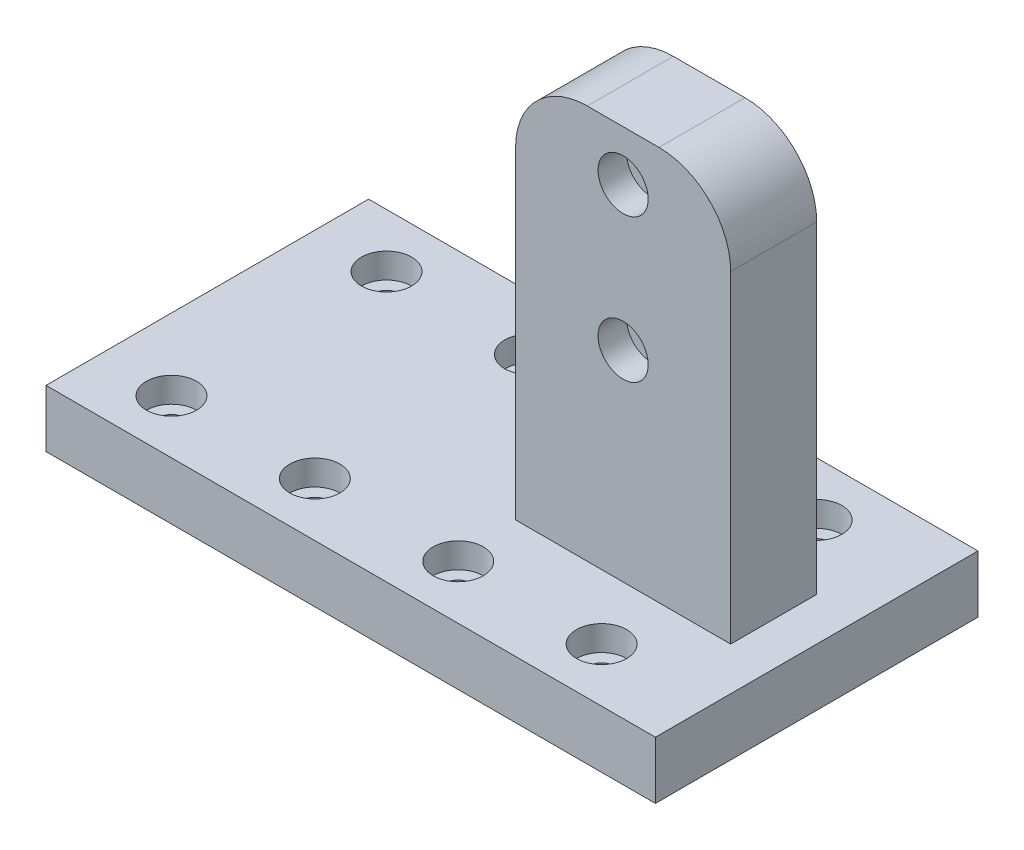
ISO-10303-21;
HEADER;
FILE_DESCRIPTION(('STEP AP214'),'2;1');
FILE_NAME('part.step','',(''),(''),'','','');
FILE_SCHEMA(('AUTOMOTIVE_DESIGN { 1 0 10303 214 1 1 1 1 }'));
ENDSEC;
DATA;
#1=APPLICATION_CONTEXT('core data for automotive mechanical design processes');
#2=APPLICATION_PROTOCOL_DEFINITION('international standard','automotive_design',2000,#1);
#3=PRODUCT_CONTEXT('',#1,'mechanical');
#4=PRODUCT('Part','Part','',(#3));
#5=PRODUCT_RELATED_PRODUCT_CATEGORY('part','',(#4));
#6=PRODUCT_DEFINITION_FORMATION('','',#4);
#7=PRODUCT_DEFINITION_CONTEXT('part definition',#1,'design');
#8=PRODUCT_DEFINITION('design','',#6,#7);
#9=PRODUCT_DEFINITION_SHAPE('','',#8);
#10=(LENGTH_UNIT() NAMED_UNIT(*) SI_UNIT(.MILLI.,.METRE.));
#11=(NAMED_UNIT(*) PLANE_ANGLE_UNIT() SI_UNIT($,.RADIAN.));
#12=(NAMED_UNIT(*) SI_UNIT($,.STERADIAN.) SOLID_ANGLE_UNIT());
#13=UNCERTAINTY_MEASURE_WITH_UNIT(LENGTH_MEASURE(1.E-05),#10,'distance_accuracy_value','');
#14=(GEOMETRIC_REPRESENTATION_CONTEXT(3) GLOBAL_UNCERTAINTY_ASSIGNED_CONTEXT((#13)) GLOBAL_UNIT_ASSIGNED_CONTEXT((#10,
#11,#12)) REPRESENTATION_CONTEXT('',''));
#15=CARTESIAN_POINT('',(0.,0.,0.));
#16=DIRECTION('',(0.,0.,1.));
#17=DIRECTION('',(1.,0.,0.));
#18=AXIS2_PLACEMENT_3D('',#15,#16,#17);
#19=CARTESIAN_POINT('',(14.,36.,6.));
#20=DIRECTION('',(0.,0.,-1.));
#21=DIRECTION('',(-1.,0.,0.));
#22=AXIS2_PLACEMENT_3D('',#19,#20,#21);
#23=CYLINDRICAL_SURFACE('',#22,1.75);
#24=CARTESIAN_POINT('',(14.,36.,-6.));
#25=DIRECTION('',(0.,0.,-1.));
#26=DIRECTION('',(-1.,0.,0.));
#27=AXIS2_PLACEMENT_3D('',#24,#25,#26);
#28=CIRCLE('',#27,1.75);
#29=CARTESIAN_POINT('',(12.25,36.,-6.));
#30=VERTEX_POINT('',#29);
#31=EDGE_CURVE('E230',#30,#30,#28,.T.);
#32=ORIENTED_EDGE('',*,*,#31,.T.);
#33=EDGE_LOOP('',(#32));
#34=FACE_BOUND('',#33,.T.);
#35=CARTESIAN_POINT('',(14.,36.,2.));
#36=DIRECTION('',(0.,0.,1.));
#37=DIRECTION('',(1.,0.,0.));
#38=AXIS2_PLACEMENT_3D('',#35,#36,#37);
#39=CIRCLE('',#38,1.75);
#40=CARTESIAN_POINT('',(15.75,36.,2.));
#41=VERTEX_POINT('',#40);
#42=EDGE_CURVE('E48',#41,#41,#39,.F.);
#43=ORIENTED_EDGE('',*,*,#42,.F.);
#44=EDGE_LOOP('',(#43));
#45=FACE_BOUND('',#44,.T.);
#46=ADVANCED_FACE('F44',(#34,#45),#23,.F.);
#47=CARTESIAN_POINT('',(14.,56.,6.));
#48=DIRECTION('',(0.,0.,-1.));
#49=DIRECTION('',(-1.,0.,0.));
#50=AXIS2_PLACEMENT_3D('',#47,#48,#49);
#51=CYLINDRICAL_SURFACE('',#50,1.75);
#52=CARTESIAN_POINT('',(14.,56.,-6.));
#53=DIRECTION('',(0.,0.,-1.));
#54=DIRECTION('',(-1.,0.,0.));
#55=AXIS2_PLACEMENT_3D('',#52,#53,#54);
#56=CIRCLE('',#55,1.75);
#57=CARTESIAN_POINT('',(12.25,56.,-6.));
#58=VERTEX_POINT('',#57);
#59=EDGE_CURVE('E248',#58,#58,#56,.T.);
#60=ORIENTED_EDGE('',*,*,#59,.T.);
#61=EDGE_LOOP('',(#60));
#62=FACE_BOUND('',#61,.T.);
#63=CARTESIAN_POINT('',(14.,56.,2.));
#64=DIRECTION('',(0.,0.,1.));
#65=DIRECTION('',(1.,0.,0.));
#66=AXIS2_PLACEMENT_3D('',#63,#64,#65);
#67=CIRCLE('',#66,1.75);
#68=CARTESIAN_POINT('',(15.75,56.,2.));
#69=VERTEX_POINT('',#68);
#70=EDGE_CURVE('E221',#69,#69,#67,.F.);
#71=ORIENTED_EDGE('',*,*,#70,.F.);
#72=EDGE_LOOP('',(#71));
#73=FACE_BOUND('',#72,.T.);
#74=ADVANCED_FACE('F413',(#62,#73),#51,.F.);
#75=CARTESIAN_POINT('',(0.,8.,0.));
#76=DIRECTION('',(0.,1.,0.));
#77=DIRECTION('',(0.,0.,1.));
#78=AXIS2_PLACEMENT_3D('',#75,#76,#77);
#79=PLANE('',#78);
#80=DIRECTION('',(0.,0.,1.));
#81=VECTOR('',#80,1.);
#82=CARTESIAN_POINT('',(35.,8.,22.5));
#83=LINE('',#82,#81);
#84=CARTESIAN_POINT('',(35.,8.,-22.5));
#85=VERTEX_POINT('',#84);
#86=CARTESIAN_POINT('',(35.,8.,22.5));
#87=VERTEX_POINT('',#86);
#88=EDGE_CURVE('E132',#85,#87,#83,.T.);
#89=ORIENTED_EDGE('',*,*,#88,.F.);
#90=DIRECTION('',(-1.,0.,0.));
#91=VECTOR('',#90,1.);
#92=CARTESIAN_POINT('',(-50.,8.,-22.5));
#93=LINE('',#92,#91);
#94=CARTESIAN_POINT('',(-50.,8.,-22.5));
#95=VERTEX_POINT('',#94);
#96=EDGE_CURVE('E140',#85,#95,#93,.T.);
#97=ORIENTED_EDGE('',*,*,#96,.T.);
#98=DIRECTION('',(0.,0.,1.));
#99=VECTOR('',#98,1.);
#100=CARTESIAN_POINT('',(-50.,8.,-22.5));
#101=LINE('',#100,#99);
#102=CARTESIAN_POINT('',(-50.,8.,22.5));
#103=VERTEX_POINT('',#102);
#104=EDGE_CURVE('E148',#95,#103,#101,.T.);
#105=ORIENTED_EDGE('',*,*,#104,.T.);
#106=DIRECTION('',(1.,0.,0.));
#107=VECTOR('',#106,1.);
#108=CARTESIAN_POINT('',(-50.,8.,22.5));
#109=LINE('',#108,#107);
#110=EDGE_CURVE('E154',#103,#87,#109,.T.);
#111=ORIENTED_EDGE('',*,*,#110,.T.);
#112=EDGE_LOOP('',(#89,#97,#105,#111));
#113=FACE_BOUND('',#112,.T.);
#114=CARTESIAN_POINT('',(-40.,8.,15.));
#115=DIRECTION('',(0.,1.,0.));
#116=DIRECTION('',(0.,0.,1.));
#117=AXIS2_PLACEMENT_3D('',#114,#115,#116);
#118=CIRCLE('',#117,3.5);
#119=CARTESIAN_POINT('',(-40.,8.,18.5));
#120=VERTEX_POINT('',#119);
#121=EDGE_CURVE('E328',#120,#120,#118,.T.);
#122=ORIENTED_EDGE('',*,*,#121,.F.);
#123=EDGE_LOOP('',(#122));
#124=FACE_BOUND('',#123,.T.);
#125=CARTESIAN_POINT('',(20.,8.,-15.));
#126=DIRECTION('',(0.,1.,0.));
#127=DIRECTION('',(0.,0.,1.));
#128=AXIS2_PLACEMENT_3D('',#125,#126,#127);
#129=CIRCLE('',#128,3.5);
#130=CARTESIAN_POINT('',(20.,8.,-11.5));
#131=VERTEX_POINT('',#130);
#132=EDGE_CURVE('E319',#131,#131,#129,.T.);
#133=ORIENTED_EDGE('',*,*,#132,.F.);
#134=EDGE_LOOP('',(#133));
#135=FACE_BOUND('',#134,.T.);
#136=CARTESIAN_POINT('',(0.,8.,-15.));
#137=DIRECTION('',(0.,1.,0.));
#138=DIRECTION('',(0.,0.,1.));
#139=AXIS2_PLACEMENT_3D('',#136,#137,#138);
#140=CIRCLE('',#139,3.5);
#141=CARTESIAN_POINT('',(0.,8.,-11.5));
#142=VERTEX_POINT('',#141);
#143=EDGE_CURVE('E344',#142,#142,#140,.T.);
#144=ORIENTED_EDGE('',*,*,#143,.F.);
#145=EDGE_LOOP('',(#144));
#146=FACE_BOUND('',#145,.T.);
#147=CARTESIAN_POINT('',(-20.,8.,-15.));
#148=DIRECTION('',(0.,1.,0.));
#149=DIRECTION('',(0.,0.,1.));
#150=AXIS2_PLACEMENT_3D('',#147,#148,#149);
#151=CIRCLE('',#150,3.5);
#152=CARTESIAN_POINT('',(-20.,8.,-11.5));
#153=VERTEX_POINT('',#152);
#154=EDGE_CURVE('E335',#153,#153,#151,.T.);
#155=ORIENTED_EDGE('',*,*,#154,.F.);
#156=EDGE_LOOP('',(#155));
#157=FACE_BOUND('',#156,.T.);
#158=CARTESIAN_POINT('',(-20.,8.,15.));
#159=DIRECTION('',(0.,1.,0.));
#160=DIRECTION('',(0.,0.,1.));
#161=AXIS2_PLACEMENT_3D('',#158,#159,#160);
#162=CIRCLE('',#161,3.5);
#163=CARTESIAN_POINT('',(-20.,8.,18.5));
#164=VERTEX_POINT('',#163);
#165=EDGE_CURVE('E295',#164,#164,#162,.T.);
#166=ORIENTED_EDGE('',*,*,#165,.F.);
#167=EDGE_LOOP('',(#166));
#168=FACE_BOUND('',#167,.T.);
#169=CARTESIAN_POINT('',(0.,8.,15.));
#170=DIRECTION('',(0.,1.,0.));
#171=DIRECTION('',(0.,0.,1.));
#172=AXIS2_PLACEMENT_3D('',#169,#170,#171);
#173=CIRCLE('',#172,3.5);
#174=CARTESIAN_POINT('',(0.,8.,18.5));
#175=VERTEX_POINT('',#174);
#176=EDGE_CURVE('E304',#175,#175,#173,.T.);
#177=ORIENTED_EDGE('',*,*,#176,.F.);
#178=EDGE_LOOP('',(#177));
#179=FACE_BOUND('',#178,.T.);
#180=CARTESIAN_POINT('',(20.,8.,15.));
#181=DIRECTION('',(0.,1.,0.));
#182=DIRECTION('',(0.,0.,1.));
#183=AXIS2_PLACEMENT_3D('',#180,#181,#182);
#184=CIRCLE('',#183,3.5);
#185=CARTESIAN_POINT('',(20.,8.,18.5));
#186=VERTEX_POINT('',#185);
#187=EDGE_CURVE('E312',#186,#186,#184,.T.);
#188=ORIENTED_EDGE('',*,*,#187,.F.);
#189=EDGE_LOOP('',(#188));
#190=FACE_BOUND('',#189,.T.);
#191=CARTESIAN_POINT('',(-40.,8.,-15.));
#192=DIRECTION('',(0.,1.,0.));
#193=DIRECTION('',(0.,0.,1.));
#194=AXIS2_PLACEMENT_3D('',#191,#192,#193);
#195=CIRCLE('',#194,3.5);
#196=CARTESIAN_POINT('',(-40.,8.,-11.5));
#197=VERTEX_POINT('',#196);
#198=EDGE_CURVE('E339',#197,#197,#195,.T.);
#199=ORIENTED_EDGE('',*,*,#198,.F.);
#200=EDGE_LOOP('',(#199));
#201=FACE_BOUND('',#200,.T.);
#202=DIRECTION('',(1.,0.,0.));
#203=VECTOR('',#202,1.);
#204=CARTESIAN_POINT('',(-0.999999999999977,8.,6.));
#205=LINE('',#204,#203);
#206=CARTESIAN_POINT('',(-0.999999999999977,8.,6.));
#207=VERTEX_POINT('',#206);
#208=CARTESIAN_POINT('',(29.,8.,6.));
#209=VERTEX_POINT('',#208);
#210=EDGE_CURVE('E272',#207,#209,#205,.T.);
#211=ORIENTED_EDGE('',*,*,#210,.F.);
#212=DIRECTION('',(0.,0.,1.));
#213=VECTOR('',#212,1.);
#214=CARTESIAN_POINT('',(-0.99999999999998,8.,-6.));
#215=LINE('',#214,#213);
#216=CARTESIAN_POINT('',(-0.99999999999998,8.,-6.));
#217=VERTEX_POINT('',#216);
#218=EDGE_CURVE('E258',#217,#207,#215,.T.);
#219=ORIENTED_EDGE('',*,*,#218,.F.);
#220=DIRECTION('',(-1.,0.,0.));
#221=VECTOR('',#220,1.);
#222=CARTESIAN_POINT('',(-0.99999999999998,8.,-6.));
#223=LINE('',#222,#221);
#224=CARTESIAN_POINT('',(29.,8.,-6.));
#225=VERTEX_POINT('',#224);
#226=EDGE_CURVE('E264',#225,#217,#223,.T.);
#227=ORIENTED_EDGE('',*,*,#226,.F.);
#228=DIRECTION('',(0.,0.,-1.));
#229=VECTOR('',#228,1.);
#230=CARTESIAN_POINT('',(29.,8.,-6.));
#231=LINE('',#230,#229);
#232=EDGE_CURVE('E276',#209,#225,#231,.T.);
#233=ORIENTED_EDGE('',*,*,#232,.F.);
#234=EDGE_LOOP('',(#211,#219,#227,#233));
#235=FACE_BOUND('',#234,.T.);
#236=ADVANCED_FACE('F398',(#113,#124,#135,#146,#157,#168,#179,#190,#201,#235),#79,.T.);
#237=CARTESIAN_POINT('',(20.,0.,-15.));
#238=DIRECTION('',(0.,1.,0.));
#239=DIRECTION('',(0.,0.,1.));
#240=AXIS2_PLACEMENT_3D('',#237,#238,#239);
#241=CYLINDRICAL_SURFACE('',#240,1.75000000000001);
#242=CARTESIAN_POINT('',(20.,0.,-15.));
#243=DIRECTION('',(0.,1.,0.));
#244=DIRECTION('',(0.,0.,1.));
#245=AXIS2_PLACEMENT_3D('',#242,#243,#244);
#246=CIRCLE('',#245,1.75000000000001);
#247=CARTESIAN_POINT('',(20.,0.,-13.25));
#248=VERTEX_POINT('',#247);
#249=EDGE_CURVE('E381',#248,#248,#246,.T.);
#250=ORIENTED_EDGE('',*,*,#249,.F.);
#251=EDGE_LOOP('',(#250));
#252=FACE_BOUND('',#251,.T.);
#253=CARTESIAN_POINT('',(20.,4.5,-15.));
#254=DIRECTION('',(0.,1.,0.));
#255=DIRECTION('',(0.,0.,1.));
#256=AXIS2_PLACEMENT_3D('',#253,#254,#255);
#257=CIRCLE('',#256,1.75000000000001);
#258=CARTESIAN_POINT('',(20.,4.5,-13.25));
#259=VERTEX_POINT('',#258);
#260=EDGE_CURVE('E196',#259,#259,#257,.F.);
#261=ORIENTED_EDGE('',*,*,#260,.F.);
#262=EDGE_LOOP('',(#261));
#263=FACE_BOUND('',#262,.T.);
#264=ADVANCED_FACE('F520',(#252,#263),#241,.F.);
#265=CARTESIAN_POINT('',(-20.,0.,15.));
#266=DIRECTION('',(0.,1.,0.));
#267=DIRECTION('',(0.,0.,1.));
#268=AXIS2_PLACEMENT_3D('',#265,#266,#267);
#269=CYLINDRICAL_SURFACE('',#268,1.75);
#270=CARTESIAN_POINT('',(-20.,0.,15.));
#271=DIRECTION('',(0.,1.,0.));
#272=DIRECTION('',(0.,0.,1.));
#273=AXIS2_PLACEMENT_3D('',#270,#271,#272);
#274=CIRCLE('',#273,1.75);
#275=CARTESIAN_POINT('',(-20.,0.,16.75));
#276=VERTEX_POINT('',#275);
#277=EDGE_CURVE('E361',#276,#276,#274,.T.);
#278=ORIENTED_EDGE('',*,*,#277,.F.);
#279=EDGE_LOOP('',(#278));
#280=FACE_BOUND('',#279,.T.);
#281=CARTESIAN_POINT('',(-20.,4.5,15.));
#282=DIRECTION('',(0.,1.,0.));
#283=DIRECTION('',(0.,0.,1.));
#284=AXIS2_PLACEMENT_3D('',#281,#282,#283);
#285=CIRCLE('',#284,1.75);
#286=CARTESIAN_POINT('',(-20.,4.5,16.75));
#287=VERTEX_POINT('',#286);
#288=EDGE_CURVE('E192',#287,#287,#285,.F.);
#289=ORIENTED_EDGE('',*,*,#288,.F.);
#290=EDGE_LOOP('',(#289));
#291=FACE_BOUND('',#290,.T.);
#292=ADVANCED_FACE('F517',(#280,#291),#269,.F.);
#293=CARTESIAN_POINT('',(-40.,0.,-15.));
#294=DIRECTION('',(0.,1.,0.));
#295=DIRECTION('',(0.,0.,1.));
#296=AXIS2_PLACEMENT_3D('',#293,#294,#295);
#297=CYLINDRICAL_SURFACE('',#296,1.75);
#298=CARTESIAN_POINT('',(-40.,0.,-15.));
#299=DIRECTION('',(0.,1.,0.));
#300=DIRECTION('',(0.,0.,1.));
#301=AXIS2_PLACEMENT_3D('',#298,#299,#300);
#302=CIRCLE('',#301,1.75);
#303=CARTESIAN_POINT('',(-40.,0.,-13.25));
#304=VERTEX_POINT('',#303);
#305=EDGE_CURVE('E360',#304,#304,#302,.T.);
#306=ORIENTED_EDGE('',*,*,#305,.F.);
#307=EDGE_LOOP('',(#306));
#308=FACE_BOUND('',#307,.T.);
#309=CARTESIAN_POINT('',(-40.,4.5,-15.));
#310=DIRECTION('',(0.,1.,0.));
#311=DIRECTION('',(0.,0.,1.));
#312=AXIS2_PLACEMENT_3D('',#309,#310,#311);
#313=CIRCLE('',#312,1.75);
#314=CARTESIAN_POINT('',(-40.,4.5,-13.25));
#315=VERTEX_POINT('',#314);
#316=EDGE_CURVE('E188',#315,#315,#313,.F.);
#317=ORIENTED_EDGE('',*,*,#316,.F.);
#318=EDGE_LOOP('',(#317));
#319=FACE_BOUND('',#318,.T.);
#320=ADVANCED_FACE('F515',(#308,#319),#297,.F.);
#321=CARTESIAN_POINT('',(-40.,0.,15.));
#322=DIRECTION('',(0.,1.,0.));
#323=DIRECTION('',(0.,0.,1.));
#324=AXIS2_PLACEMENT_3D('',#321,#322,#323);
#325=CYLINDRICAL_SURFACE('',#324,1.75);
#326=CARTESIAN_POINT('',(-40.,0.,15.));
#327=DIRECTION('',(0.,1.,0.));
#328=DIRECTION('',(0.,0.,1.));
#329=AXIS2_PLACEMENT_3D('',#326,#327,#328);
#330=CIRCLE('',#329,1.75);
#331=CARTESIAN_POINT('',(-40.,0.,16.75));
#332=VERTEX_POINT('',#331);
#333=EDGE_CURVE('E200',#332,#332,#330,.T.);
#334=ORIENTED_EDGE('',*,*,#333,.F.);
#335=EDGE_LOOP('',(#334));
#336=FACE_BOUND('',#335,.T.);
#337=CARTESIAN_POINT('',(-40.,4.5,15.));
#338=DIRECTION('',(0.,1.,0.));
#339=DIRECTION('',(0.,0.,1.));
#340=AXIS2_PLACEMENT_3D('',#337,#338,#339);
#341=CIRCLE('',#340,1.75);
#342=CARTESIAN_POINT('',(-40.,4.5,16.75));
#343=VERTEX_POINT('',#342);
#344=EDGE_CURVE('E184',#343,#343,#341,.F.);
#345=ORIENTED_EDGE('',*,*,#344,.F.);
#346=EDGE_LOOP('',(#345));
#347=FACE_BOUND('',#346,.T.);
#348=ADVANCED_FACE('F511',(#336,#347),#325,.F.);
#349=CARTESIAN_POINT('',(20.,0.,15.));
#350=DIRECTION('',(0.,1.,0.));
#351=DIRECTION('',(0.,0.,1.));
#352=AXIS2_PLACEMENT_3D('',#349,#350,#351);
#353=CYLINDRICAL_SURFACE('',#352,1.75);
#354=CARTESIAN_POINT('',(20.,0.,15.));
#355=DIRECTION('',(0.,1.,0.));
#356=DIRECTION('',(0.,0.,1.));
#357=AXIS2_PLACEMENT_3D('',#354,#355,#356);
#358=CIRCLE('',#357,1.75);
#359=CARTESIAN_POINT('',(20.,0.,16.75));
#360=VERTEX_POINT('',#359);
#361=EDGE_CURVE('E377',#360,#360,#358,.T.);
#362=ORIENTED_EDGE('',*,*,#361,.F.);
#363=EDGE_LOOP('',(#362));
#364=FACE_BOUND('',#363,.T.);
#365=CARTESIAN_POINT('',(20.,4.5,15.));
#366=DIRECTION('',(0.,1.,0.));
#367=DIRECTION('',(0.,0.,1.));
#368=AXIS2_PLACEMENT_3D('',#365,#366,#367);
#369=CIRCLE('',#368,1.75);
#370=CARTESIAN_POINT('',(20.,4.5,16.75));
#371=VERTEX_POINT('',#370);
#372=EDGE_CURVE('E180',#371,#371,#369,.F.);
#373=ORIENTED_EDGE('',*,*,#372,.F.);
#374=EDGE_LOOP('',(#373));
#375=FACE_BOUND('',#374,.T.);
#376=ADVANCED_FACE('F514',(#364,#375),#353,.F.);
#377=CARTESIAN_POINT('',(0.,0.,-15.));
#378=DIRECTION('',(0.,1.,0.));
#379=DIRECTION('',(0.,0.,1.));
#380=AXIS2_PLACEMENT_3D('',#377,#378,#379);
#381=CYLINDRICAL_SURFACE('',#380,1.75);
#382=CARTESIAN_POINT('',(0.,0.,-15.));
#383=DIRECTION('',(0.,1.,0.));
#384=DIRECTION('',(0.,0.,1.));
#385=AXIS2_PLACEMENT_3D('',#382,#383,#384);
#386=CIRCLE('',#385,1.75);
#387=CARTESIAN_POINT('',(0.,0.,-13.25));
#388=VERTEX_POINT('',#387);
#389=EDGE_CURVE('E373',#388,#388,#386,.T.);
#390=ORIENTED_EDGE('',*,*,#389,.F.);
#391=EDGE_LOOP('',(#390));
#392=FACE_BOUND('',#391,.T.);
#393=CARTESIAN_POINT('',(0.,4.5,-15.));
#394=DIRECTION('',(0.,1.,0.));
#395=DIRECTION('',(0.,0.,1.));
#396=AXIS2_PLACEMENT_3D('',#393,#394,#395);
#397=CIRCLE('',#396,1.75);
#398=CARTESIAN_POINT('',(0.,4.5,-13.25));
#399=VERTEX_POINT('',#398);
#400=EDGE_CURVE('E176',#399,#399,#397,.F.);
#401=ORIENTED_EDGE('',*,*,#400,.F.);
#402=EDGE_LOOP('',(#401));
#403=FACE_BOUND('',#402,.T.);
#404=ADVANCED_FACE('F528',(#392,#403),#381,.F.);
#405=CARTESIAN_POINT('',(0.,0.,15.));
#406=DIRECTION('',(0.,1.,0.));
#407=DIRECTION('',(0.,0.,1.));
#408=AXIS2_PLACEMENT_3D('',#405,#406,#407);
#409=CYLINDRICAL_SURFACE('',#408,1.75);
#410=CARTESIAN_POINT('',(0.,0.,15.));
#411=DIRECTION('',(0.,1.,0.));
#412=DIRECTION('',(0.,0.,1.));
#413=AXIS2_PLACEMENT_3D('',#410,#411,#412);
#414=CIRCLE('',#413,1.75);
#415=CARTESIAN_POINT('',(0.,0.,16.75));
#416=VERTEX_POINT('',#415);
#417=EDGE_CURVE('E369',#416,#416,#414,.T.);
#418=ORIENTED_EDGE('',*,*,#417,.F.);
#419=EDGE_LOOP('',(#418));
#420=FACE_BOUND('',#419,.T.);
#421=CARTESIAN_POINT('',(0.,4.5,15.));
#422=DIRECTION('',(0.,1.,0.));
#423=DIRECTION('',(0.,0.,1.));
#424=AXIS2_PLACEMENT_3D('',#421,#422,#423);
#425=CIRCLE('',#424,1.75);
#426=CARTESIAN_POINT('',(0.,4.5,16.75));
#427=VERTEX_POINT('',#426);
#428=EDGE_CURVE('E171',#427,#427,#425,.F.);
#429=ORIENTED_EDGE('',*,*,#428,.F.);
#430=EDGE_LOOP('',(#429));
#431=FACE_BOUND('',#430,.T.);
#432=ADVANCED_FACE('F525',(#420,#431),#409,.F.);
#433=CARTESIAN_POINT('',(-20.,0.,-15.));
#434=DIRECTION('',(0.,1.,0.));
#435=DIRECTION('',(0.,0.,1.));
#436=AXIS2_PLACEMENT_3D('',#433,#434,#435);
#437=CYLINDRICAL_SURFACE('',#436,1.75);
#438=CARTESIAN_POINT('',(-20.,0.,-15.));
#439=DIRECTION('',(0.,1.,0.));
#440=DIRECTION('',(0.,0.,1.));
#441=AXIS2_PLACEMENT_3D('',#438,#439,#440);
#442=CIRCLE('',#441,1.75);
#443=CARTESIAN_POINT('',(-20.,0.,-13.25));
#444=VERTEX_POINT('',#443);
#445=EDGE_CURVE('E365',#444,#444,#442,.T.);
#446=ORIENTED_EDGE('',*,*,#445,.F.);
#447=EDGE_LOOP('',(#446));
#448=FACE_BOUND('',#447,.T.);
#449=CARTESIAN_POINT('',(-20.,4.5,-15.));
#450=DIRECTION('',(0.,1.,0.));
#451=DIRECTION('',(0.,0.,1.));
#452=AXIS2_PLACEMENT_3D('',#449,#450,#451);
#453=CIRCLE('',#452,1.75);
#454=CARTESIAN_POINT('',(-20.,4.5,-13.25));
#455=VERTEX_POINT('',#454);
#456=EDGE_CURVE('E167',#455,#455,#453,.F.);
#457=ORIENTED_EDGE('',*,*,#456,.F.);
#458=EDGE_LOOP('',(#457));
#459=FACE_BOUND('',#458,.T.);
#460=ADVANCED_FACE('F410',(#448,#459),#437,.F.);
#461=CARTESIAN_POINT('',(-50.,8.,-22.5));
#462=DIRECTION('',(1.,0.,0.));
#463=DIRECTION('',(0.,0.,-1.));
#464=AXIS2_PLACEMENT_3D('',#461,#462,#463);
#465=PLANE('',#464);
#466=DIRECTION('',(0.,0.,1.));
#467=VECTOR('',#466,1.);
#468=CARTESIAN_POINT('',(-50.,0.,-22.5));
#469=LINE('',#468,#467);
#470=CARTESIAN_POINT('',(-50.,0.,-22.5));
#471=VERTEX_POINT('',#470);
#472=CARTESIAN_POINT('',(-50.,0.,22.5));
#473=VERTEX_POINT('',#472);
#474=EDGE_CURVE('E146',#471,#473,#469,.T.);
#475=ORIENTED_EDGE('',*,*,#474,.T.);
#476=DIRECTION('',(0.,-1.,0.));
#477=VECTOR('',#476,1.);
#478=CARTESIAN_POINT('',(-50.,8.,22.5));
#479=LINE('',#478,#477);
#480=EDGE_CURVE('E162',#103,#473,#479,.T.);
#481=ORIENTED_EDGE('',*,*,#480,.F.);
#482=ORIENTED_EDGE('',*,*,#104,.F.);
#483=DIRECTION('',(0.,-1.,0.));
#484=VECTOR('',#483,1.);
#485=CARTESIAN_POINT('',(-50.,8.,-22.5));
#486=LINE('',#485,#484);
#487=EDGE_CURVE('E159',#95,#471,#486,.T.);
#488=ORIENTED_EDGE('',*,*,#487,.T.);
#489=EDGE_LOOP('',(#475,#481,#482,#488));
#490=FACE_BOUND('',#489,.T.);
#491=ADVANCED_FACE('F395',(#490),#465,.F.);
#492=CARTESIAN_POINT('',(-50.,8.,22.5));
#493=DIRECTION('',(0.,0.,-1.));
#494=DIRECTION('',(-1.,0.,0.));
#495=AXIS2_PLACEMENT_3D('',#492,#493,#494);
#496=PLANE('',#495);
#497=DIRECTION('',(1.,0.,0.));
#498=VECTOR('',#497,1.);
#499=CARTESIAN_POINT('',(-50.,0.,22.5));
#500=LINE('',#499,#498);
#501=CARTESIAN_POINT('',(35.,0.,22.5));
#502=VERTEX_POINT('',#501);
#503=EDGE_CURVE('E149',#473,#502,#500,.T.);
#504=ORIENTED_EDGE('',*,*,#503,.T.);
#505=DIRECTION('',(0.,1.,0.));
#506=VECTOR('',#505,1.);
#507=CARTESIAN_POINT('',(35.,0.,22.5));
#508=LINE('',#507,#506);
#509=EDGE_CURVE('E127',#502,#87,#508,.T.);
#510=ORIENTED_EDGE('',*,*,#509,.T.);
#511=ORIENTED_EDGE('',*,*,#110,.F.);
#512=ORIENTED_EDGE('',*,*,#480,.T.);
#513=EDGE_LOOP('',(#504,#510,#511,#512));
#514=FACE_BOUND('',#513,.T.);
#515=ADVANCED_FACE('F401',(#514),#496,.F.);
#516=CARTESIAN_POINT('',(-50.,8.,-22.5));
#517=DIRECTION('',(0.,0.,1.));
#518=DIRECTION('',(1.,0.,0.));
#519=AXIS2_PLACEMENT_3D('',#516,#517,#518);
#520=PLANE('',#519);
#521=ORIENTED_EDGE('',*,*,#96,.F.);
#522=DIRECTION('',(0.,1.,0.));
#523=VECTOR('',#522,1.);
#524=CARTESIAN_POINT('',(35.,0.,-22.5));
#525=LINE('',#524,#523);
#526=CARTESIAN_POINT('',(35.,0.,-22.5));
#527=VERTEX_POINT('',#526);
#528=EDGE_CURVE('E124',#527,#85,#525,.T.);
#529=ORIENTED_EDGE('',*,*,#528,.F.);
#530=DIRECTION('',(-1.,0.,0.));
#531=VECTOR('',#530,1.);
#532=CARTESIAN_POINT('',(-50.,0.,-22.5));
#533=LINE('',#532,#531);
#534=EDGE_CURVE('E138',#527,#471,#533,.T.);
#535=ORIENTED_EDGE('',*,*,#534,.T.);
#536=ORIENTED_EDGE('',*,*,#487,.F.);
#537=EDGE_LOOP('',(#521,#529,#535,#536));
#538=FACE_BOUND('',#537,.T.);
#539=ADVANCED_FACE('F136',(#538),#520,.F.);
#540=CARTESIAN_POINT('',(0.,0.,0.));
#541=DIRECTION('',(0.,1.,0.));
#542=DIRECTION('',(0.,0.,1.));
#543=AXIS2_PLACEMENT_3D('',#540,#541,#542);
#544=PLANE('',#543);
#545=ORIENTED_EDGE('',*,*,#445,.T.);
#546=EDGE_LOOP('',(#545));
#547=FACE_BOUND('',#546,.T.);
#548=ORIENTED_EDGE('',*,*,#417,.T.);
#549=EDGE_LOOP('',(#548));
#550=FACE_BOUND('',#549,.T.);
#551=ORIENTED_EDGE('',*,*,#389,.T.);
#552=EDGE_LOOP('',(#551));
#553=FACE_BOUND('',#552,.T.);
#554=ORIENTED_EDGE('',*,*,#361,.T.);
#555=EDGE_LOOP('',(#554));
#556=FACE_BOUND('',#555,.T.);
#557=ORIENTED_EDGE('',*,*,#333,.T.);
#558=EDGE_LOOP('',(#557));
#559=FACE_BOUND('',#558,.T.);
#560=ORIENTED_EDGE('',*,*,#305,.T.);
#561=EDGE_LOOP('',(#560));
#562=FACE_BOUND('',#561,.T.);
#563=ORIENTED_EDGE('',*,*,#277,.T.);
#564=EDGE_LOOP('',(#563));
#565=FACE_BOUND('',#564,.T.);
#566=ORIENTED_EDGE('',*,*,#249,.T.);
#567=EDGE_LOOP('',(#566));
#568=FACE_BOUND('',#567,.T.);
#569=ORIENTED_EDGE('',*,*,#534,.F.);
#570=DIRECTION('',(0.,0.,1.));
#571=VECTOR('',#570,1.);
#572=CARTESIAN_POINT('',(35.,0.,22.5));
#573=LINE('',#572,#571);
#574=EDGE_CURVE('E121',#527,#502,#573,.T.);
#575=ORIENTED_EDGE('',*,*,#574,.T.);
#576=ORIENTED_EDGE('',*,*,#503,.F.);
#577=ORIENTED_EDGE('',*,*,#474,.F.);
#578=EDGE_LOOP('',(#569,#575,#576,#577));
#579=FACE_BOUND('',#578,.T.);
#580=ADVANCED_FACE('F144',(#547,#550,#553,#556,#559,#562,#565,#568,#579),#544,.F.);
#581=CARTESIAN_POINT('',(-20.,4.5,-15.));
#582=DIRECTION('',(0.,1.,0.));
#583=DIRECTION('',(0.,0.,1.));
#584=AXIS2_PLACEMENT_3D('',#581,#582,#583);
#585=PLANE('',#584);
#586=CARTESIAN_POINT('',(-20.,4.5,-15.));
#587=DIRECTION('',(0.,1.,0.));
#588=DIRECTION('',(0.,0.,1.));
#589=AXIS2_PLACEMENT_3D('',#586,#587,#588);
#590=CIRCLE('',#589,3.5);
#591=CARTESIAN_POINT('',(-20.,4.5,-11.5));
#592=VERTEX_POINT('',#591);
#593=EDGE_CURVE('E340',#592,#592,#590,.T.);
#594=ORIENTED_EDGE('',*,*,#593,.T.);
#595=EDGE_LOOP('',(#594));
#596=FACE_BOUND('',#595,.T.);
#597=ORIENTED_EDGE('',*,*,#456,.T.);
#598=EDGE_LOOP('',(#597));
#599=FACE_BOUND('',#598,.T.);
#600=ADVANCED_FACE('F494',(#596,#599),#585,.T.);
#601=CARTESIAN_POINT('',(-20.,4.5,-15.));
#602=DIRECTION('',(0.,1.,0.));
#603=DIRECTION('',(0.,0.,1.));
#604=AXIS2_PLACEMENT_3D('',#601,#602,#603);
#605=CYLINDRICAL_SURFACE('',#604,3.5);
#606=ORIENTED_EDGE('',*,*,#593,.F.);
#607=EDGE_LOOP('',(#606));
#608=FACE_BOUND('',#607,.T.);
#609=ORIENTED_EDGE('',*,*,#154,.T.);
#610=EDGE_LOOP('',(#609));
#611=FACE_BOUND('',#610,.T.);
#612=ADVANCED_FACE('F466',(#608,#611),#605,.F.);
#613=CARTESIAN_POINT('',(0.,4.5,15.));
#614=DIRECTION('',(0.,1.,0.));
#615=DIRECTION('',(0.,0.,1.));
#616=AXIS2_PLACEMENT_3D('',#613,#614,#615);
#617=PLANE('',#616);
#618=CARTESIAN_POINT('',(0.,4.5,15.));
#619=DIRECTION('',(0.,1.,0.));
#620=DIRECTION('',(0.,0.,1.));
#621=AXIS2_PLACEMENT_3D('',#618,#619,#620);
#622=CIRCLE('',#621,3.5);
#623=CARTESIAN_POINT('',(0.,4.5,18.5));
#624=VERTEX_POINT('',#623);
#625=EDGE_CURVE('E308',#624,#624,#622,.T.);
#626=ORIENTED_EDGE('',*,*,#625,.T.);
#627=EDGE_LOOP('',(#626));
#628=FACE_BOUND('',#627,.T.);
#629=ORIENTED_EDGE('',*,*,#428,.T.);
#630=EDGE_LOOP('',(#629));
#631=FACE_BOUND('',#630,.T.);
#632=ADVANCED_FACE('F462',(#628,#631),#617,.T.);
#633=CARTESIAN_POINT('',(0.,4.5,15.));
#634=DIRECTION('',(0.,1.,0.));
#635=DIRECTION('',(0.,0.,1.));
#636=AXIS2_PLACEMENT_3D('',#633,#634,#635);
#637=CYLINDRICAL_SURFACE('',#636,3.5);
#638=ORIENTED_EDGE('',*,*,#625,.F.);
#639=EDGE_LOOP('',(#638));
#640=FACE_BOUND('',#639,.T.);
#641=ORIENTED_EDGE('',*,*,#176,.T.);
#642=EDGE_LOOP('',(#641));
#643=FACE_BOUND('',#642,.T.);
#644=ADVANCED_FACE('F458',(#640,#643),#637,.F.);
#645=CARTESIAN_POINT('',(0.,4.5,-15.));
#646=DIRECTION('',(0.,1.,0.));
#647=DIRECTION('',(0.,0.,1.));
#648=AXIS2_PLACEMENT_3D('',#645,#646,#647);
#649=PLANE('',#648);
#650=CARTESIAN_POINT('',(0.,4.5,-15.));
#651=DIRECTION('',(0.,1.,0.));
#652=DIRECTION('',(0.,0.,1.));
#653=AXIS2_PLACEMENT_3D('',#650,#651,#652);
#654=CIRCLE('',#653,3.5);
#655=CARTESIAN_POINT('',(0.,4.5,-11.5));
#656=VERTEX_POINT('',#655);
#657=EDGE_CURVE('E323',#656,#656,#654,.T.);
#658=ORIENTED_EDGE('',*,*,#657,.T.);
#659=EDGE_LOOP('',(#658));
#660=FACE_BOUND('',#659,.T.);
#661=ORIENTED_EDGE('',*,*,#400,.T.);
#662=EDGE_LOOP('',(#661));
#663=FACE_BOUND('',#662,.T.);
#664=ADVANCED_FACE('F461',(#660,#663),#649,.T.);
#665=CARTESIAN_POINT('',(0.,4.5,-15.));
#666=DIRECTION('',(0.,1.,0.));
#667=DIRECTION('',(0.,0.,1.));
#668=AXIS2_PLACEMENT_3D('',#665,#666,#667);
#669=CYLINDRICAL_SURFACE('',#668,3.5);
#670=ORIENTED_EDGE('',*,*,#657,.F.);
#671=EDGE_LOOP('',(#670));
#672=FACE_BOUND('',#671,.T.);
#673=ORIENTED_EDGE('',*,*,#143,.T.);
#674=EDGE_LOOP('',(#673));
#675=FACE_BOUND('',#674,.T.);
#676=ADVANCED_FACE('F476',(#672,#675),#669,.F.);
#677=CARTESIAN_POINT('',(20.,4.5,15.));
#678=DIRECTION('',(0.,1.,0.));
#679=DIRECTION('',(0.,0.,1.));
#680=AXIS2_PLACEMENT_3D('',#677,#678,#679);
#681=PLANE('',#680);
#682=CARTESIAN_POINT('',(20.,4.5,15.));
#683=DIRECTION('',(0.,1.,0.));
#684=DIRECTION('',(0.,0.,1.));
#685=AXIS2_PLACEMENT_3D('',#682,#683,#684);
#686=CIRCLE('',#685,3.5);
#687=CARTESIAN_POINT('',(20.,4.5,18.5));
#688=VERTEX_POINT('',#687);
#689=EDGE_CURVE('E294',#688,#688,#686,.T.);
#690=ORIENTED_EDGE('',*,*,#689,.T.);
#691=EDGE_LOOP('',(#690));
#692=FACE_BOUND('',#691,.T.);
#693=ORIENTED_EDGE('',*,*,#372,.T.);
#694=EDGE_LOOP('',(#693));
#695=FACE_BOUND('',#694,.T.);
#696=ADVANCED_FACE('F472',(#692,#695),#681,.T.);
#697=CARTESIAN_POINT('',(20.,4.5,15.));
#698=DIRECTION('',(0.,1.,0.));
#699=DIRECTION('',(0.,0.,1.));
#700=AXIS2_PLACEMENT_3D('',#697,#698,#699);
#701=CYLINDRICAL_SURFACE('',#700,3.5);
#702=ORIENTED_EDGE('',*,*,#689,.F.);
#703=EDGE_LOOP('',(#702));
#704=FACE_BOUND('',#703,.T.);
#705=ORIENTED_EDGE('',*,*,#187,.T.);
#706=EDGE_LOOP('',(#705));
#707=FACE_BOUND('',#706,.T.);
#708=ADVANCED_FACE('F468',(#704,#707),#701,.F.);
#709=CARTESIAN_POINT('',(-40.,4.5,15.));
#710=DIRECTION('',(0.,1.,0.));
#711=DIRECTION('',(0.,0.,1.));
#712=AXIS2_PLACEMENT_3D('',#709,#710,#711);
#713=PLANE('',#712);
#714=CARTESIAN_POINT('',(-40.,4.5,15.));
#715=DIRECTION('',(0.,1.,0.));
#716=DIRECTION('',(0.,0.,1.));
#717=AXIS2_PLACEMENT_3D('',#714,#715,#716);
#718=CIRCLE('',#717,3.5);
#719=CARTESIAN_POINT('',(-40.,4.5,18.5));
#720=VERTEX_POINT('',#719);
#721=EDGE_CURVE('E299',#720,#720,#718,.T.);
#722=ORIENTED_EDGE('',*,*,#721,.T.);
#723=EDGE_LOOP('',(#722));
#724=FACE_BOUND('',#723,.T.);
#725=ORIENTED_EDGE('',*,*,#344,.T.);
#726=EDGE_LOOP('',(#725));
#727=FACE_BOUND('',#726,.T.);
#728=ADVANCED_FACE('F471',(#724,#727),#713,.T.);
#729=CARTESIAN_POINT('',(-40.,4.5,15.));
#730=DIRECTION('',(0.,1.,0.));
#731=DIRECTION('',(0.,0.,1.));
#732=AXIS2_PLACEMENT_3D('',#729,#730,#731);
#733=CYLINDRICAL_SURFACE('',#732,3.5);
#734=ORIENTED_EDGE('',*,*,#721,.F.);
#735=EDGE_LOOP('',(#734));
#736=FACE_BOUND('',#735,.T.);
#737=ORIENTED_EDGE('',*,*,#121,.T.);
#738=EDGE_LOOP('',(#737));
#739=FACE_BOUND('',#738,.T.);
#740=ADVANCED_FACE('F484',(#736,#739),#733,.F.);
#741=CARTESIAN_POINT('',(-40.,4.5,-15.));
#742=DIRECTION('',(0.,1.,0.));
#743=DIRECTION('',(0.,0.,1.));
#744=AXIS2_PLACEMENT_3D('',#741,#742,#743);
#745=PLANE('',#744);
#746=CARTESIAN_POINT('',(-40.,4.5,-15.));
#747=DIRECTION('',(0.,1.,0.));
#748=DIRECTION('',(0.,0.,1.));
#749=AXIS2_PLACEMENT_3D('',#746,#747,#748);
#750=CIRCLE('',#749,3.5);
#751=CARTESIAN_POINT('',(-40.,4.5,-11.5));
#752=VERTEX_POINT('',#751);
#753=EDGE_CURVE('E172',#752,#752,#750,.T.);
#754=ORIENTED_EDGE('',*,*,#753,.T.);
#755=EDGE_LOOP('',(#754));
#756=FACE_BOUND('',#755,.T.);
#757=ORIENTED_EDGE('',*,*,#316,.T.);
#758=EDGE_LOOP('',(#757));
#759=FACE_BOUND('',#758,.T.);
#760=ADVANCED_FACE('F487',(#756,#759),#745,.T.);
#761=CARTESIAN_POINT('',(-40.,4.5,-15.));
#762=DIRECTION('',(0.,1.,0.));
#763=DIRECTION('',(0.,0.,1.));
#764=AXIS2_PLACEMENT_3D('',#761,#762,#763);
#765=CYLINDRICAL_SURFACE('',#764,3.5);
#766=ORIENTED_EDGE('',*,*,#753,.F.);
#767=EDGE_LOOP('',(#766));
#768=FACE_BOUND('',#767,.T.);
#769=ORIENTED_EDGE('',*,*,#198,.T.);
#770=EDGE_LOOP('',(#769));
#771=FACE_BOUND('',#770,.T.);
#772=ADVANCED_FACE('F456',(#768,#771),#765,.F.);
#773=CARTESIAN_POINT('',(-20.,4.5,15.));
#774=DIRECTION('',(0.,1.,0.));
#775=DIRECTION('',(0.,0.,1.));
#776=AXIS2_PLACEMENT_3D('',#773,#774,#775);
#777=PLANE('',#776);
#778=CARTESIAN_POINT('',(-20.,4.5,15.));
#779=DIRECTION('',(0.,1.,0.));
#780=DIRECTION('',(0.,0.,1.));
#781=AXIS2_PLACEMENT_3D('',#778,#779,#780);
#782=CIRCLE('',#781,3.5);
#783=CARTESIAN_POINT('',(-20.,4.5,18.5));
#784=VERTEX_POINT('',#783);
#785=EDGE_CURVE('E300',#784,#784,#782,.T.);
#786=ORIENTED_EDGE('',*,*,#785,.T.);
#787=EDGE_LOOP('',(#786));
#788=FACE_BOUND('',#787,.T.);
#789=ORIENTED_EDGE('',*,*,#288,.T.);
#790=EDGE_LOOP('',(#789));
#791=FACE_BOUND('',#790,.T.);
#792=ADVANCED_FACE('F452',(#788,#791),#777,.T.);
#793=CARTESIAN_POINT('',(-20.,4.5,15.));
#794=DIRECTION('',(0.,1.,0.));
#795=DIRECTION('',(0.,0.,1.));
#796=AXIS2_PLACEMENT_3D('',#793,#794,#795);
#797=CYLINDRICAL_SURFACE('',#796,3.5);
#798=ORIENTED_EDGE('',*,*,#785,.F.);
#799=EDGE_LOOP('',(#798));
#800=FACE_BOUND('',#799,.T.);
#801=ORIENTED_EDGE('',*,*,#165,.T.);
#802=EDGE_LOOP('',(#801));
#803=FACE_BOUND('',#802,.T.);
#804=ADVANCED_FACE('F448',(#800,#803),#797,.F.);
#805=CARTESIAN_POINT('',(20.,4.5,-15.));
#806=DIRECTION('',(0.,1.,0.));
#807=DIRECTION('',(0.,0.,1.));
#808=AXIS2_PLACEMENT_3D('',#805,#806,#807);
#809=PLANE('',#808);
#810=CARTESIAN_POINT('',(20.,4.5,-15.));
#811=DIRECTION('',(0.,1.,0.));
#812=DIRECTION('',(0.,0.,1.));
#813=AXIS2_PLACEMENT_3D('',#810,#811,#812);
#814=CIRCLE('',#813,3.5);
#815=CARTESIAN_POINT('',(20.,4.5,-11.5));
#816=VERTEX_POINT('',#815);
#817=EDGE_CURVE('E324',#816,#816,#814,.T.);
#818=ORIENTED_EDGE('',*,*,#817,.T.);
#819=EDGE_LOOP('',(#818));
#820=FACE_BOUND('',#819,.T.);
#821=ORIENTED_EDGE('',*,*,#260,.T.);
#822=EDGE_LOOP('',(#821));
#823=FACE_BOUND('',#822,.T.);
#824=ADVANCED_FACE('F451',(#820,#823),#809,.T.);
#825=CARTESIAN_POINT('',(20.,4.5,-15.));
#826=DIRECTION('',(0.,1.,0.));
#827=DIRECTION('',(0.,0.,1.));
#828=AXIS2_PLACEMENT_3D('',#825,#826,#827);
#829=CYLINDRICAL_SURFACE('',#828,3.5);
#830=ORIENTED_EDGE('',*,*,#817,.F.);
#831=EDGE_LOOP('',(#830));
#832=FACE_BOUND('',#831,.T.);
#833=ORIENTED_EDGE('',*,*,#132,.T.);
#834=EDGE_LOOP('',(#833));
#835=FACE_BOUND('',#834,.T.);
#836=ADVANCED_FACE('F447',(#832,#835),#829,.F.);
#837=CARTESIAN_POINT('',(-0.99999999999998,63.,-6.));
#838=DIRECTION('',(1.,0.,0.));
#839=DIRECTION('',(0.,0.,-1.));
#840=AXIS2_PLACEMENT_3D('',#837,#838,#839);
#841=PLANE('',#840);
#842=DIRECTION('',(0.,-1.,0.));
#843=VECTOR('',#842,1.);
#844=CARTESIAN_POINT('',(-0.999999999999977,63.,6.));
#845=LINE('',#844,#843);
#846=CARTESIAN_POINT('',(-0.999999999999977,53.,6.));
#847=VERTEX_POINT('',#846);
#848=EDGE_CURVE('E291',#847,#207,#845,.T.);
#849=ORIENTED_EDGE('',*,*,#848,.F.);
#850=DIRECTION('',(0.,0.,1.));
#851=VECTOR('',#850,1.);
#852=CARTESIAN_POINT('',(-0.99999999999998,53.,-6.));
#853=LINE('',#852,#851);
#854=CARTESIAN_POINT('',(-0.99999999999998,53.,-6.));
#855=VERTEX_POINT('',#854);
#856=EDGE_CURVE('E54',#847,#855,#853,.F.);
#857=ORIENTED_EDGE('',*,*,#856,.T.);
#858=DIRECTION('',(0.,-1.,0.));
#859=VECTOR('',#858,1.);
#860=CARTESIAN_POINT('',(-0.99999999999998,63.,-6.));
#861=LINE('',#860,#859);
#862=EDGE_CURVE('E268',#855,#217,#861,.T.);
#863=ORIENTED_EDGE('',*,*,#862,.T.);
#864=ORIENTED_EDGE('',*,*,#218,.T.);
#865=EDGE_LOOP('',(#849,#857,#863,#864));
#866=FACE_BOUND('',#865,.T.);
#867=ADVANCED_FACE('F443',(#866),#841,.F.);
#868=CARTESIAN_POINT('',(-0.999999999999977,63.,6.));
#869=DIRECTION('',(0.,0.,-1.));
#870=DIRECTION('',(-1.,0.,0.));
#871=AXIS2_PLACEMENT_3D('',#868,#869,#870);
#872=PLANE('',#871);
#873=CARTESIAN_POINT('',(14.,36.,6.));
#874=DIRECTION('',(0.,0.,1.));
#875=DIRECTION('',(1.,0.,0.));
#876=AXIS2_PLACEMENT_3D('',#873,#874,#875);
#877=CIRCLE('',#876,3.5);
#878=CARTESIAN_POINT('',(17.5,36.,6.));
#879=VERTEX_POINT('',#878);
#880=EDGE_CURVE('E232',#879,#879,#877,.T.);
#881=ORIENTED_EDGE('',*,*,#880,.F.);
#882=EDGE_LOOP('',(#881));
#883=FACE_BOUND('',#882,.T.);
#884=CARTESIAN_POINT('',(14.,56.,6.));
#885=DIRECTION('',(0.,0.,1.));
#886=DIRECTION('',(1.,0.,0.));
#887=AXIS2_PLACEMENT_3D('',#884,#885,#886);
#888=CIRCLE('',#887,3.5);
#889=CARTESIAN_POINT('',(17.5,56.,6.));
#890=VERTEX_POINT('',#889);
#891=EDGE_CURVE('E238',#890,#890,#888,.T.);
#892=ORIENTED_EDGE('',*,*,#891,.F.);
#893=EDGE_LOOP('',(#892));
#894=FACE_BOUND('',#893,.T.);
#895=DIRECTION('',(1.,0.,0.));
#896=VECTOR('',#895,1.);
#897=CARTESIAN_POINT('',(-0.999999999999977,63.,6.));
#898=LINE('',#897,#896);
#899=CARTESIAN_POINT('',(9.00000000000002,63.,6.));
#900=VERTEX_POINT('',#899);
#901=CARTESIAN_POINT('',(19.,63.,6.));
#902=VERTEX_POINT('',#901);
#903=EDGE_CURVE('E260',#900,#902,#898,.T.);
#904=ORIENTED_EDGE('',*,*,#903,.F.);
#905=CARTESIAN_POINT('',(9.00000000000002,53.,6.));
#906=DIRECTION('',(0.,0.,-1.));
#907=DIRECTION('',(-1.,0.,0.));
#908=AXIS2_PLACEMENT_3D('',#905,#906,#907);
#909=CIRCLE('',#908,10.);
#910=EDGE_CURVE('E69',#900,#847,#909,.F.);
#911=ORIENTED_EDGE('',*,*,#910,.T.);
#912=ORIENTED_EDGE('',*,*,#848,.T.);
#913=ORIENTED_EDGE('',*,*,#210,.T.);
#914=DIRECTION('',(0.,-1.,0.));
#915=VECTOR('',#914,1.);
#916=CARTESIAN_POINT('',(29.,63.,6.));
#917=LINE('',#916,#915);
#918=CARTESIAN_POINT('',(29.,53.,6.));
#919=VERTEX_POINT('',#918);
#920=EDGE_CURVE('E288',#919,#209,#917,.T.);
#921=ORIENTED_EDGE('',*,*,#920,.F.);
#922=CARTESIAN_POINT('',(19.,53.,6.));
#923=DIRECTION('',(0.,0.,-1.));
#924=DIRECTION('',(-1.,0.,0.));
#925=AXIS2_PLACEMENT_3D('',#922,#923,#924);
#926=CIRCLE('',#925,10.);
#927=EDGE_CURVE('E210',#919,#902,#926,.F.);
#928=ORIENTED_EDGE('',*,*,#927,.T.);
#929=EDGE_LOOP('',(#904,#911,#912,#913,#921,#928));
#930=FACE_BOUND('',#929,.T.);
#931=ADVANCED_FACE('F439',(#883,#894,#930),#872,.F.);
#932=CARTESIAN_POINT('',(29.,63.,-6.));
#933=DIRECTION('',(-1.,0.,0.));
#934=DIRECTION('',(0.,0.,1.));
#935=AXIS2_PLACEMENT_3D('',#932,#933,#934);
#936=PLANE('',#935);
#937=DIRECTION('',(0.,-1.,0.));
#938=VECTOR('',#937,1.);
#939=CARTESIAN_POINT('',(29.,63.,-6.));
#940=LINE('',#939,#938);
#941=CARTESIAN_POINT('',(29.,53.,-6.));
#942=VERTEX_POINT('',#941);
#943=EDGE_CURVE('E285',#942,#225,#940,.T.);
#944=ORIENTED_EDGE('',*,*,#943,.F.);
#945=DIRECTION('',(0.,0.,-1.));
#946=VECTOR('',#945,1.);
#947=CARTESIAN_POINT('',(29.,53.,6.));
#948=LINE('',#947,#946);
#949=EDGE_CURVE('E207',#942,#919,#948,.F.);
#950=ORIENTED_EDGE('',*,*,#949,.T.);
#951=ORIENTED_EDGE('',*,*,#920,.T.);
#952=ORIENTED_EDGE('',*,*,#232,.T.);
#953=EDGE_LOOP('',(#944,#950,#951,#952));
#954=FACE_BOUND('',#953,.T.);
#955=ADVANCED_FACE('F435',(#954),#936,.F.);
#956=CARTESIAN_POINT('',(-0.99999999999998,63.,-6.));
#957=DIRECTION('',(0.,0.,1.));
#958=DIRECTION('',(1.,0.,0.));
#959=AXIS2_PLACEMENT_3D('',#956,#957,#958);
#960=PLANE('',#959);
#961=ORIENTED_EDGE('',*,*,#59,.F.);
#962=EDGE_LOOP('',(#961));
#963=FACE_BOUND('',#962,.T.);
#964=ORIENTED_EDGE('',*,*,#31,.F.);
#965=EDGE_LOOP('',(#964));
#966=FACE_BOUND('',#965,.T.);
#967=ORIENTED_EDGE('',*,*,#862,.F.);
#968=CARTESIAN_POINT('',(9.00000000000002,53.,-6.));
#969=DIRECTION('',(0.,0.,1.));
#970=DIRECTION('',(1.,0.,0.));
#971=AXIS2_PLACEMENT_3D('',#968,#969,#970);
#972=CIRCLE('',#971,10.);
#973=CARTESIAN_POINT('',(9.00000000000002,63.,-6.));
#974=VERTEX_POINT('',#973);
#975=EDGE_CURVE('E11',#855,#974,#972,.F.);
#976=ORIENTED_EDGE('',*,*,#975,.T.);
#977=DIRECTION('',(-1.,0.,0.));
#978=VECTOR('',#977,1.);
#979=CARTESIAN_POINT('',(-0.99999999999998,63.,-6.));
#980=LINE('',#979,#978);
#981=CARTESIAN_POINT('',(19.,63.,-6.));
#982=VERTEX_POINT('',#981);
#983=EDGE_CURVE('E263',#982,#974,#980,.T.);
#984=ORIENTED_EDGE('',*,*,#983,.F.);
#985=CARTESIAN_POINT('',(19.,53.,-6.));
#986=DIRECTION('',(0.,0.,1.));
#987=DIRECTION('',(1.,0.,0.));
#988=AXIS2_PLACEMENT_3D('',#985,#986,#987);
#989=CIRCLE('',#988,10.);
#990=EDGE_CURVE('E204',#982,#942,#989,.F.);
#991=ORIENTED_EDGE('',*,*,#990,.T.);
#992=ORIENTED_EDGE('',*,*,#943,.T.);
#993=ORIENTED_EDGE('',*,*,#226,.T.);
#994=EDGE_LOOP('',(#967,#976,#984,#991,#992,#993));
#995=FACE_BOUND('',#994,.T.);
#996=ADVANCED_FACE('F431',(#963,#966,#995),#960,.F.);
#997=CARTESIAN_POINT('',(0.,63.,0.));
#998=DIRECTION('',(0.,1.,0.));
#999=DIRECTION('',(0.,0.,1.));
#1000=AXIS2_PLACEMENT_3D('',#997,#998,#999);
#1001=PLANE('',#1000);
#1002=ORIENTED_EDGE('',*,*,#983,.T.);
#1003=DIRECTION('',(0.,0.,1.));
#1004=VECTOR('',#1003,1.);
#1005=CARTESIAN_POINT('',(9.00000000000002,63.,6.));
#1006=LINE('',#1005,#1004);
#1007=EDGE_CURVE('E214',#974,#900,#1006,.T.);
#1008=ORIENTED_EDGE('',*,*,#1007,.T.);
#1009=ORIENTED_EDGE('',*,*,#903,.T.);
#1010=DIRECTION('',(0.,0.,-1.));
#1011=VECTOR('',#1010,1.);
#1012=CARTESIAN_POINT('',(19.,63.,-6.));
#1013=LINE('',#1012,#1011);
#1014=EDGE_CURVE('E166',#902,#982,#1013,.T.);
#1015=ORIENTED_EDGE('',*,*,#1014,.T.);
#1016=EDGE_LOOP('',(#1002,#1008,#1009,#1015));
#1017=FACE_BOUND('',#1016,.T.);
#1018=ADVANCED_FACE('F428',(#1017),#1001,.T.);
#1019=CARTESIAN_POINT('',(35.,0.,22.5));
#1020=DIRECTION('',(-1.,0.,0.));
#1021=DIRECTION('',(0.,0.,1.));
#1022=AXIS2_PLACEMENT_3D('',#1019,#1020,#1021);
#1023=PLANE('',#1022);
#1024=ORIENTED_EDGE('',*,*,#88,.T.);
#1025=ORIENTED_EDGE('',*,*,#509,.F.);
#1026=ORIENTED_EDGE('',*,*,#574,.F.);
#1027=ORIENTED_EDGE('',*,*,#528,.T.);
#1028=EDGE_LOOP('',(#1024,#1025,#1026,#1027));
#1029=FACE_BOUND('',#1028,.T.);
#1030=ADVANCED_FACE('F123',(#1029),#1023,.F.);
#1031=CARTESIAN_POINT('',(19.,53.,0.));
#1032=DIRECTION('',(0.,0.,1.));
#1033=DIRECTION('',(1.,0.,0.));
#1034=AXIS2_PLACEMENT_3D('',#1031,#1032,#1033);
#1035=CYLINDRICAL_SURFACE('',#1034,10.);
#1036=ORIENTED_EDGE('',*,*,#927,.F.);
#1037=ORIENTED_EDGE('',*,*,#949,.F.);
#1038=ORIENTED_EDGE('',*,*,#990,.F.);
#1039=ORIENTED_EDGE('',*,*,#1014,.F.);
#1040=EDGE_LOOP('',(#1036,#1037,#1038,#1039));
#1041=FACE_BOUND('',#1040,.T.);
#1042=ADVANCED_FACE('F427',(#1041),#1035,.T.);
#1043=CARTESIAN_POINT('',(9.00000000000002,53.,0.));
#1044=DIRECTION('',(0.,0.,-1.));
#1045=DIRECTION('',(-1.,0.,0.));
#1046=AXIS2_PLACEMENT_3D('',#1043,#1044,#1045);
#1047=CYLINDRICAL_SURFACE('',#1046,10.);
#1048=ORIENTED_EDGE('',*,*,#975,.F.);
#1049=ORIENTED_EDGE('',*,*,#856,.F.);
#1050=ORIENTED_EDGE('',*,*,#910,.F.);
#1051=ORIENTED_EDGE('',*,*,#1007,.F.);
#1052=EDGE_LOOP('',(#1048,#1049,#1050,#1051));
#1053=FACE_BOUND('',#1052,.T.);
#1054=ADVANCED_FACE('F46',(#1053),#1047,.T.);
#1055=CARTESIAN_POINT('',(14.,56.,2.));
#1056=DIRECTION('',(0.,0.,1.));
#1057=DIRECTION('',(1.,0.,0.));
#1058=AXIS2_PLACEMENT_3D('',#1055,#1056,#1057);
#1059=PLANE('',#1058);
#1060=CARTESIAN_POINT('',(14.,56.,2.));
#1061=DIRECTION('',(0.,0.,1.));
#1062=DIRECTION('',(1.,0.,0.));
#1063=AXIS2_PLACEMENT_3D('',#1060,#1061,#1062);
#1064=CIRCLE('',#1063,3.5);
#1065=CARTESIAN_POINT('',(17.5,56.,2.));
#1066=VERTEX_POINT('',#1065);
#1067=EDGE_CURVE('E244',#1066,#1066,#1064,.T.);
#1068=ORIENTED_EDGE('',*,*,#1067,.T.);
#1069=EDGE_LOOP('',(#1068));
#1070=FACE_BOUND('',#1069,.T.);
#1071=ORIENTED_EDGE('',*,*,#70,.T.);
#1072=EDGE_LOOP('',(#1071));
#1073=FACE_BOUND('',#1072,.T.);
#1074=ADVANCED_FACE('F628',(#1070,#1073),#1059,.T.);
#1075=CARTESIAN_POINT('',(14.,56.,2.));
#1076=DIRECTION('',(0.,0.,1.));
#1077=DIRECTION('',(1.,0.,0.));
#1078=AXIS2_PLACEMENT_3D('',#1075,#1076,#1077);
#1079=CYLINDRICAL_SURFACE('',#1078,3.5);
#1080=ORIENTED_EDGE('',*,*,#1067,.F.);
#1081=EDGE_LOOP('',(#1080));
#1082=FACE_BOUND('',#1081,.T.);
#1083=ORIENTED_EDGE('',*,*,#891,.T.);
#1084=EDGE_LOOP('',(#1083));
#1085=FACE_BOUND('',#1084,.T.);
#1086=ADVANCED_FACE('F649',(#1082,#1085),#1079,.F.);
#1087=CARTESIAN_POINT('',(14.,36.,2.));
#1088=DIRECTION('',(0.,0.,1.));
#1089=DIRECTION('',(1.,0.,0.));
#1090=AXIS2_PLACEMENT_3D('',#1087,#1088,#1089);
#1091=PLANE('',#1090);
#1092=CARTESIAN_POINT('',(14.,36.,2.));
#1093=DIRECTION('',(0.,0.,1.));
#1094=DIRECTION('',(1.,0.,0.));
#1095=AXIS2_PLACEMENT_3D('',#1092,#1093,#1094);
#1096=CIRCLE('',#1095,3.5);
#1097=CARTESIAN_POINT('',(17.5,36.,2.));
#1098=VERTEX_POINT('',#1097);
#1099=EDGE_CURVE('E224',#1098,#1098,#1096,.T.);
#1100=ORIENTED_EDGE('',*,*,#1099,.T.);
#1101=EDGE_LOOP('',(#1100));
#1102=FACE_BOUND('',#1101,.T.);
#1103=ORIENTED_EDGE('',*,*,#42,.T.);
#1104=EDGE_LOOP('',(#1103));
#1105=FACE_BOUND('',#1104,.T.);
#1106=ADVANCED_FACE('F658',(#1102,#1105),#1091,.T.);
#1107=CARTESIAN_POINT('',(14.,36.,2.));
#1108=DIRECTION('',(0.,0.,1.));
#1109=DIRECTION('',(1.,0.,0.));
#1110=AXIS2_PLACEMENT_3D('',#1107,#1108,#1109);
#1111=CYLINDRICAL_SURFACE('',#1110,3.5);
#1112=ORIENTED_EDGE('',*,*,#1099,.F.);
#1113=EDGE_LOOP('',(#1112));
#1114=FACE_BOUND('',#1113,.T.);
#1115=ORIENTED_EDGE('',*,*,#880,.T.);
#1116=EDGE_LOOP('',(#1115));
#1117=FACE_BOUND('',#1116,.T.);
#1118=ADVANCED_FACE('F668',(#1114,#1117),#1111,.F.);
#1119=CLOSED_SHELL('',(#46,#74,#236,#264,#292,#320,#348,#376,#404,#432,#460,#491,#515,#539,#580,
#600,#612,#632,#644,#664,#676,#696,#708,#728,#740,#760,#772,#792,#804,#824,#836,#867,#931,#955,
#996,#1018,#1030,#1042,#1054,#1074,#1086,#1106,#1118));
#1120=MANIFOLD_SOLID_BREP('B2',#1119);
#1121=ADVANCED_BREP_SHAPE_REPRESENTATION('',(#18,#1120),#14);
#1122=SHAPE_DEFINITION_REPRESENTATION(#9,#1121);
ENDSEC;
END-ISO-10303-21;
